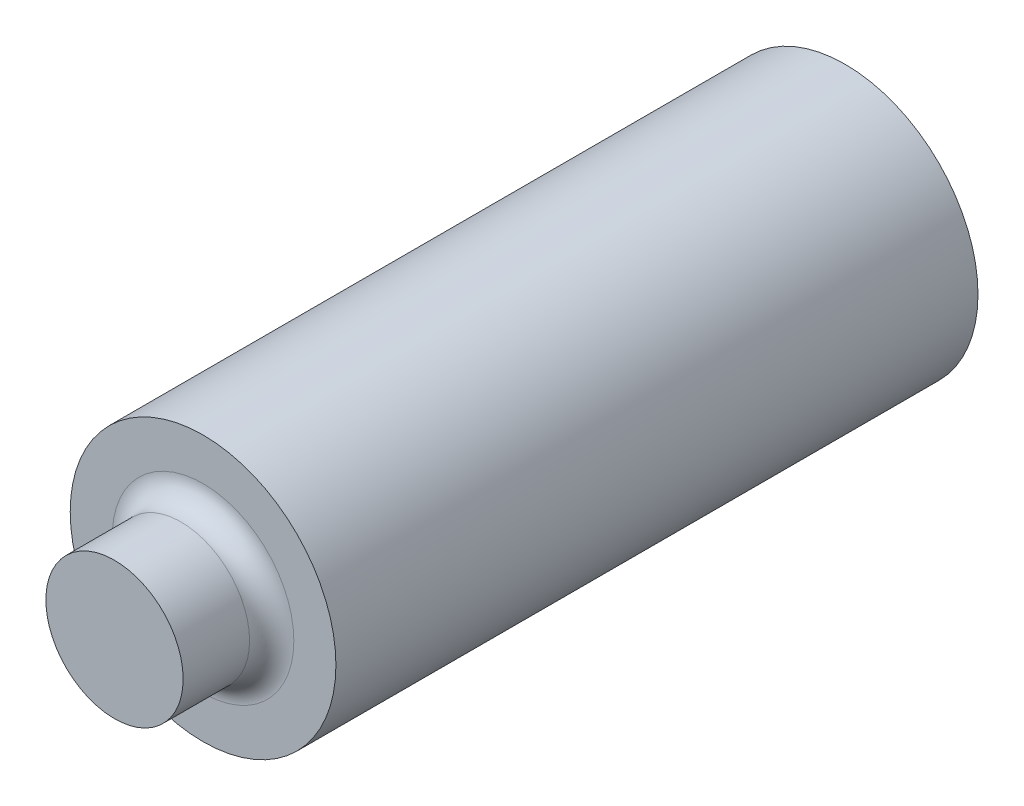
ISO-10303-21;
HEADER;
FILE_DESCRIPTION(('STEP AP214'),'2;1');
FILE_NAME('part.step','',(''),(''),'','','');
FILE_SCHEMA(('AUTOMOTIVE_DESIGN { 1 0 10303 214 1 1 1 1 }'));
ENDSEC;
DATA;
#1=APPLICATION_CONTEXT('core data for automotive mechanical design processes');
#2=APPLICATION_PROTOCOL_DEFINITION('international standard','automotive_design',2000,#1);
#3=PRODUCT_CONTEXT('',#1,'mechanical');
#4=PRODUCT('Part','Part','',(#3));
#5=PRODUCT_RELATED_PRODUCT_CATEGORY('part','',(#4));
#6=PRODUCT_DEFINITION_FORMATION('','',#4);
#7=PRODUCT_DEFINITION_CONTEXT('part definition',#1,'design');
#8=PRODUCT_DEFINITION('design','',#6,#7);
#9=PRODUCT_DEFINITION_SHAPE('','',#8);
#10=(LENGTH_UNIT() NAMED_UNIT(*) SI_UNIT(.MILLI.,.METRE.));
#11=(NAMED_UNIT(*) PLANE_ANGLE_UNIT() SI_UNIT($,.RADIAN.));
#12=(NAMED_UNIT(*) SI_UNIT($,.STERADIAN.) SOLID_ANGLE_UNIT());
#13=UNCERTAINTY_MEASURE_WITH_UNIT(LENGTH_MEASURE(1.E-05),#10,'distance_accuracy_value','');
#14=(GEOMETRIC_REPRESENTATION_CONTEXT(3) GLOBAL_UNCERTAINTY_ASSIGNED_CONTEXT((#13)) GLOBAL_UNIT_ASSIGNED_CONTEXT((#10,
#11,#12)) REPRESENTATION_CONTEXT('',''));
#15=CARTESIAN_POINT('',(0.,0.,0.));
#16=DIRECTION('',(0.,0.,1.));
#17=DIRECTION('',(1.,0.,0.));
#18=AXIS2_PLACEMENT_3D('',#15,#16,#17);
#19=CARTESIAN_POINT('',(0.,0.,14.5));
#20=DIRECTION('',(0.,0.,-1.));
#21=DIRECTION('',(-1.,0.,0.));
#22=AXIS2_PLACEMENT_3D('',#19,#20,#21);
#23=CYLINDRICAL_SURFACE('',#22,3.);
#24=CARTESIAN_POINT('',(0.,0.,14.5));
#25=DIRECTION('',(0.,0.,1.));
#26=DIRECTION('',(1.,0.,0.));
#27=AXIS2_PLACEMENT_3D('',#24,#25,#26);
#28=CIRCLE('',#27,3.);
#29=CARTESIAN_POINT('',(-3.,0.,14.5));
#30=VERTEX_POINT('',#29);
#31=EDGE_CURVE('E48',#30,#30,#28,.T.);
#32=CARTESIAN_POINT('',(0.,0.,0.));
#33=DIRECTION('',(0.,0.,1.));
#34=DIRECTION('',(1.,0.,0.));
#35=AXIS2_PLACEMENT_3D('',#32,#33,#34);
#36=CIRCLE('',#35,3.);
#37=CARTESIAN_POINT('',(-3.,0.,0.));
#38=VERTEX_POINT('',#37);
#39=EDGE_CURVE('E52',#38,#38,#36,.T.);
#40=CARTESIAN_POINT('',(-3.,0.,14.5));
#41=CARTESIAN_POINT('',(-3.,0.,14.3489583333333));
#42=CARTESIAN_POINT('',(-3.,0.,14.1979166666667));
#43=CARTESIAN_POINT('',(-3.,0.,13.8958333333333));
#44=CARTESIAN_POINT('',(-3.,0.,13.7447916666667));
#45=CARTESIAN_POINT('',(-3.,0.,13.4427083333333));
#46=CARTESIAN_POINT('',(-3.,0.,13.2916666666667));
#47=CARTESIAN_POINT('',(-3.,0.,12.9895833333333));
#48=CARTESIAN_POINT('',(-3.,0.,12.8385416666667));
#49=CARTESIAN_POINT('',(-3.,0.,12.5364583333333));
#50=CARTESIAN_POINT('',(-3.,0.,12.3854166666667));
#51=CARTESIAN_POINT('',(-3.,0.,12.0833333333333));
#52=CARTESIAN_POINT('',(-3.,0.,11.9322916666667));
#53=CARTESIAN_POINT('',(-3.,0.,11.6302083333333));
#54=CARTESIAN_POINT('',(-3.,0.,11.4791666666667));
#55=CARTESIAN_POINT('',(-3.,0.,11.1770833333333));
#56=CARTESIAN_POINT('',(-3.,0.,11.0260416666667));
#57=CARTESIAN_POINT('',(-3.,0.,10.7239583333333));
#58=CARTESIAN_POINT('',(-3.,0.,10.5729166666667));
#59=CARTESIAN_POINT('',(-3.,0.,10.2708333333333));
#60=CARTESIAN_POINT('',(-3.,0.,10.1197916666667));
#61=CARTESIAN_POINT('',(-3.,0.,9.81770833333333));
#62=CARTESIAN_POINT('',(-3.,0.,9.66666666666667));
#63=CARTESIAN_POINT('',(-3.,0.,9.36458333333333));
#64=CARTESIAN_POINT('',(-3.,0.,9.21354166666667));
#65=CARTESIAN_POINT('',(-3.,0.,8.91145833333333));
#66=CARTESIAN_POINT('',(-3.,0.,8.76041666666667));
#67=CARTESIAN_POINT('',(-3.,0.,8.45833333333333));
#68=CARTESIAN_POINT('',(-3.,0.,8.30729166666667));
#69=CARTESIAN_POINT('',(-3.,0.,8.00520833333333));
#70=CARTESIAN_POINT('',(-3.,0.,7.85416666666667));
#71=CARTESIAN_POINT('',(-3.,0.,7.55208333333333));
#72=CARTESIAN_POINT('',(-3.,0.,7.40104166666667));
#73=CARTESIAN_POINT('',(-3.,0.,7.09895833333333));
#74=CARTESIAN_POINT('',(-3.,0.,6.94791666666667));
#75=CARTESIAN_POINT('',(-3.,0.,6.64583333333333));
#76=CARTESIAN_POINT('',(-3.,0.,6.49479166666667));
#77=CARTESIAN_POINT('',(-3.,0.,6.19270833333333));
#78=CARTESIAN_POINT('',(-3.,0.,6.04166666666667));
#79=CARTESIAN_POINT('',(-3.,0.,5.73958333333333));
#80=CARTESIAN_POINT('',(-3.,0.,5.58854166666667));
#81=CARTESIAN_POINT('',(-3.,0.,5.28645833333333));
#82=CARTESIAN_POINT('',(-3.,0.,5.13541666666667));
#83=CARTESIAN_POINT('',(-3.,0.,4.83333333333333));
#84=CARTESIAN_POINT('',(-3.,0.,4.68229166666667));
#85=CARTESIAN_POINT('',(-3.,0.,4.38020833333333));
#86=CARTESIAN_POINT('',(-3.,0.,4.22916666666667));
#87=CARTESIAN_POINT('',(-3.,0.,3.92708333333333));
#88=CARTESIAN_POINT('',(-3.,0.,3.77604166666667));
#89=CARTESIAN_POINT('',(-3.,0.,3.47395833333333));
#90=CARTESIAN_POINT('',(-3.,0.,3.32291666666667));
#91=CARTESIAN_POINT('',(-3.,0.,3.02083333333333));
#92=CARTESIAN_POINT('',(-3.,0.,2.86979166666667));
#93=CARTESIAN_POINT('',(-3.,0.,2.56770833333333));
#94=CARTESIAN_POINT('',(-3.,0.,2.41666666666667));
#95=CARTESIAN_POINT('',(-3.,0.,2.11458333333333));
#96=CARTESIAN_POINT('',(-3.,0.,1.96354166666667));
#97=CARTESIAN_POINT('',(-3.,0.,1.66145833333333));
#98=CARTESIAN_POINT('',(-3.,0.,1.51041666666667));
#99=CARTESIAN_POINT('',(-3.,0.,1.20833333333333));
#100=CARTESIAN_POINT('',(-3.,0.,1.05729166666667));
#101=CARTESIAN_POINT('',(-3.,0.,0.755208333333334));
#102=CARTESIAN_POINT('',(-3.,0.,0.604166666666667));
#103=CARTESIAN_POINT('',(-3.,0.,0.302083333333333));
#104=CARTESIAN_POINT('',(-3.,0.,0.151041666666667));
#105=CARTESIAN_POINT('',(-3.,0.,0.));
#106=B_SPLINE_CURVE_WITH_KNOTS('',3,(#40,#41,#42,#43,#44,#45,#46,#47,#48,#49,#50,#51,#52,#53,
#54,#55,#56,#57,#58,#59,#60,#61,#62,#63,#64,#65,#66,#67,#68,#69,#70,#71,#72,#73,#74,#75,#76,#77,
#78,#79,#80,#81,#82,#83,#84,#85,#86,#87,#88,#89,#90,#91,#92,#93,#94,#95,#96,#97,#98,#99,#100,
#101,#102,#103,#104,#105),.UNSPECIFIED.,.F.,.F.,(4,2,2,2,2,2,2,2,2,2,2,2,2,2,2,2,2,2,2,2,2,2,2,
2,2,2,2,2,2,2,2,2,4),(0.,0.453125,0.906250000000001,1.359375,1.8125,2.265625,2.71875,3.171875,
3.625,4.078125,4.53125,4.984375,5.4375,5.890625,6.34375,6.796875,7.25,7.703125,8.15625,8.609375,
9.0625,9.515625,9.96875,10.421875,10.875,11.328125,11.78125,12.234375,12.6875,13.140625,
13.59375,14.046875,14.5),.UNSPECIFIED.);
#107=EDGE_CURVE('BSEAM37',#30,#38,#106,.T.);
#108=ORIENTED_EDGE('',*,*,#31,.F.);
#109=ORIENTED_EDGE('',*,*,#39,.T.);
#110=ORIENTED_EDGE('',*,*,#107,.T.);
#111=ORIENTED_EDGE('',*,*,#107,.F.);
#112=EDGE_LOOP('',(#108,#110,#109,#111));
#113=FACE_BOUND('',#112,.T.);
#114=ADVANCED_FACE('F37',(#113),#23,.T.);
#115=CARTESIAN_POINT('',(0.,0.,14.5));
#116=DIRECTION('',(0.,0.,1.));
#117=DIRECTION('',(1.,0.,0.));
#118=AXIS2_PLACEMENT_3D('',#115,#116,#117);
#119=PLANE('',#118);
#120=CARTESIAN_POINT('',(0.,0.,14.5));
#121=DIRECTION('',(0.,0.,1.));
#122=DIRECTION('',(1.,0.,0.));
#123=AXIS2_PLACEMENT_3D('',#120,#121,#122);
#124=CIRCLE('',#123,2.05);
#125=CARTESIAN_POINT('',(2.05,0.,14.5));
#126=VERTEX_POINT('',#125);
#127=EDGE_CURVE('E10',#126,#126,#124,.F.);
#128=ORIENTED_EDGE('',*,*,#127,.T.);
#129=EDGE_LOOP('',(#128));
#130=FACE_BOUND('',#129,.T.);
#131=ORIENTED_EDGE('',*,*,#31,.T.);
#132=EDGE_LOOP('',(#131));
#133=FACE_BOUND('',#132,.T.);
#134=ADVANCED_FACE('F72',(#130,#133),#119,.T.);
#135=CARTESIAN_POINT('',(0.,0.,0.));
#136=DIRECTION('',(0.,0.,1.));
#137=DIRECTION('',(1.,0.,0.));
#138=AXIS2_PLACEMENT_3D('',#135,#136,#137);
#139=PLANE('',#138);
#140=ORIENTED_EDGE('',*,*,#39,.F.);
#141=EDGE_LOOP('',(#140));
#142=FACE_BOUND('',#141,.T.);
#143=ADVANCED_FACE('F65',(#142),#139,.F.);
#144=CARTESIAN_POINT('',(0.,0.,16.5));
#145=DIRECTION('',(0.,0.,-1.));
#146=DIRECTION('',(-1.,0.,0.));
#147=AXIS2_PLACEMENT_3D('',#144,#145,#146);
#148=CYLINDRICAL_SURFACE('',#147,1.55);
#149=CARTESIAN_POINT('',(0.,0.,15.));
#150=DIRECTION('',(0.,0.,1.));
#151=DIRECTION('',(1.,0.,0.));
#152=AXIS2_PLACEMENT_3D('',#149,#150,#151);
#153=CIRCLE('',#152,1.55);
#154=CARTESIAN_POINT('',(1.55,0.,15.));
#155=VERTEX_POINT('',#154);
#156=EDGE_CURVE('E44',#155,#155,#153,.T.);
#157=ORIENTED_EDGE('',*,*,#156,.T.);
#158=EDGE_LOOP('',(#157));
#159=FACE_BOUND('',#158,.T.);
#160=CARTESIAN_POINT('',(0.,0.,16.5));
#161=DIRECTION('',(0.,0.,1.));
#162=DIRECTION('',(1.,0.,0.));
#163=AXIS2_PLACEMENT_3D('',#160,#161,#162);
#164=CIRCLE('',#163,1.55);
#165=CARTESIAN_POINT('',(1.55,0.,16.5));
#166=VERTEX_POINT('',#165);
#167=EDGE_CURVE('E56',#166,#166,#164,.T.);
#168=ORIENTED_EDGE('',*,*,#167,.F.);
#169=EDGE_LOOP('',(#168));
#170=FACE_BOUND('',#169,.T.);
#171=ADVANCED_FACE('F63',(#159,#170),#148,.T.);
#172=CARTESIAN_POINT('',(0.,0.,16.5));
#173=DIRECTION('',(0.,0.,1.));
#174=DIRECTION('',(1.,0.,0.));
#175=AXIS2_PLACEMENT_3D('',#172,#173,#174);
#176=PLANE('',#175);
#177=ORIENTED_EDGE('',*,*,#167,.T.);
#178=EDGE_LOOP('',(#177));
#179=FACE_BOUND('',#178,.T.);
#180=ADVANCED_FACE('F61',(#179),#176,.T.);
#181=CARTESIAN_POINT('',(0.,0.,15.));
#182=DIRECTION('',(0.,0.,1.));
#183=DIRECTION('',(1.,0.,0.));
#184=AXIS2_PLACEMENT_3D('',#181,#182,#183);
#185=TOROIDAL_SURFACE('',#184,2.05,0.5);
#186=ORIENTED_EDGE('',*,*,#127,.F.);
#187=EDGE_LOOP('',(#186));
#188=FACE_BOUND('',#187,.T.);
#189=ORIENTED_EDGE('',*,*,#156,.F.);
#190=EDGE_LOOP('',(#189));
#191=FACE_BOUND('',#190,.T.);
#192=ADVANCED_FACE('F39',(#188,#191),#185,.F.);
#193=CLOSED_SHELL('',(#114,#134,#143,#171,#180,#192));
#194=MANIFOLD_SOLID_BREP('B2',#193);
#195=ADVANCED_BREP_SHAPE_REPRESENTATION('',(#18,#194),#14);
#196=SHAPE_DEFINITION_REPRESENTATION(#9,#195);
ENDSEC;
END-ISO-10303-21;
